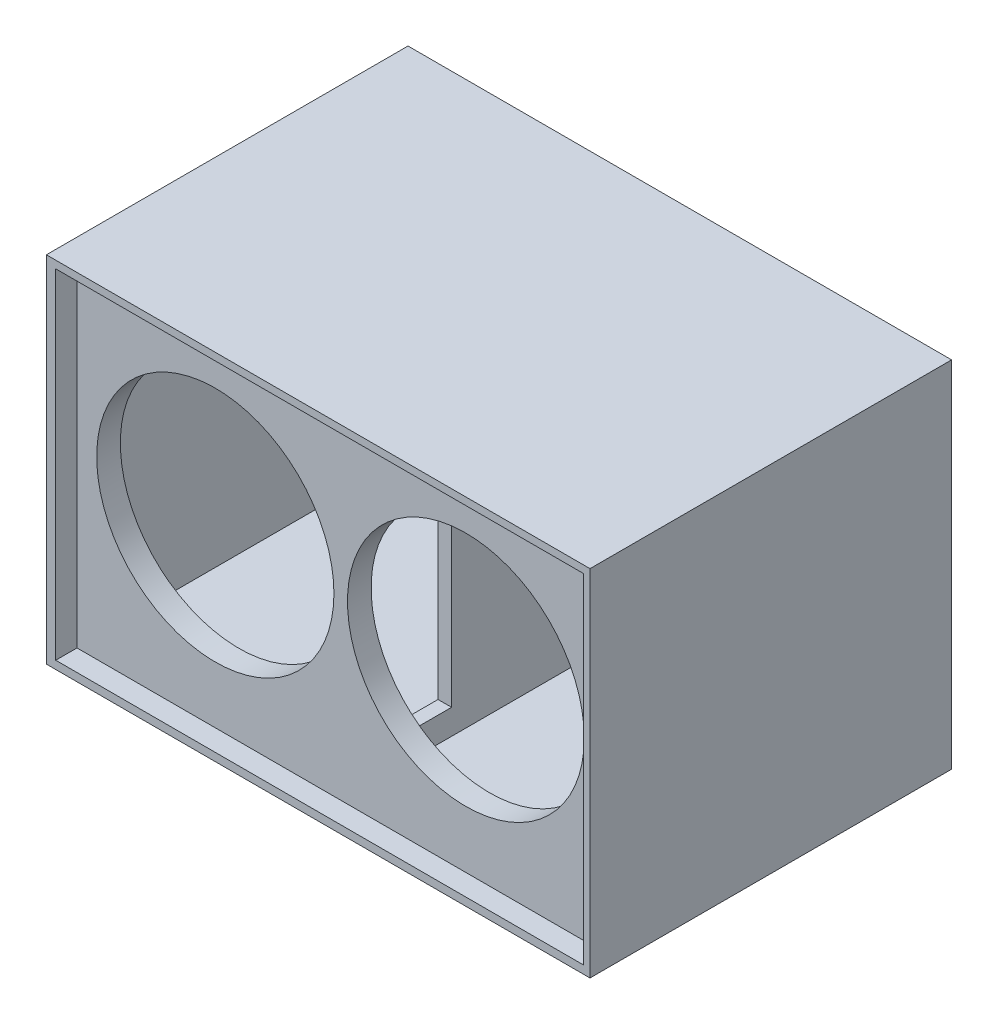
ISO-10303-21;
HEADER;
FILE_DESCRIPTION(('STEP AP214'),'2;1');
FILE_NAME('part.step','',(''),(''),'','','');
FILE_SCHEMA(('AUTOMOTIVE_DESIGN { 1 0 10303 214 1 1 1 1 }'));
ENDSEC;
DATA;
#1=APPLICATION_CONTEXT('core data for automotive mechanical design processes');
#2=APPLICATION_PROTOCOL_DEFINITION('international standard','automotive_design',2000,#1);
#3=PRODUCT_CONTEXT('',#1,'mechanical');
#4=PRODUCT('Part','Part','',(#3));
#5=PRODUCT_RELATED_PRODUCT_CATEGORY('part','',(#4));
#6=PRODUCT_DEFINITION_FORMATION('','',#4);
#7=PRODUCT_DEFINITION_CONTEXT('part definition',#1,'design');
#8=PRODUCT_DEFINITION('design','',#6,#7);
#9=PRODUCT_DEFINITION_SHAPE('','',#8);
#10=(LENGTH_UNIT() NAMED_UNIT(*) SI_UNIT(.MILLI.,.METRE.));
#11=(NAMED_UNIT(*) PLANE_ANGLE_UNIT() SI_UNIT($,.RADIAN.));
#12=(NAMED_UNIT(*) SI_UNIT($,.STERADIAN.) SOLID_ANGLE_UNIT());
#13=UNCERTAINTY_MEASURE_WITH_UNIT(LENGTH_MEASURE(1.E-05),#10,'distance_accuracy_value','');
#14=(GEOMETRIC_REPRESENTATION_CONTEXT(3) GLOBAL_UNCERTAINTY_ASSIGNED_CONTEXT((#13)) GLOBAL_UNIT_ASSIGNED_CONTEXT((#10,
#11,#12)) REPRESENTATION_CONTEXT('',''));
#15=CARTESIAN_POINT('',(0.,0.,0.));
#16=DIRECTION('',(0.,0.,1.));
#17=DIRECTION('',(1.,0.,0.));
#18=AXIS2_PLACEMENT_3D('',#15,#16,#17);
#19=CARTESIAN_POINT('',(-48.385288775752,0.,123.));
#20=DIRECTION('',(0.,0.,1.));
#21=DIRECTION('',(1.,0.,0.));
#22=AXIS2_PLACEMENT_3D('',#19,#20,#21);
#23=CYLINDRICAL_SURFACE('',#22,50.1883023827374);
#24=CARTESIAN_POINT('',(-48.385288775752,0.,134.));
#25=DIRECTION('',(0.,0.,-1.));
#26=DIRECTION('',(-1.,0.,0.));
#27=AXIS2_PLACEMENT_3D('',#24,#25,#26);
#28=CIRCLE('',#27,50.1883023827374);
#29=CARTESIAN_POINT('',(1.8030136069854,0.,134.));
#30=VERTEX_POINT('',#29);
#31=EDGE_CURVE('E335',#30,#30,#28,.F.);
#32=CARTESIAN_POINT('',(-48.385288775752,0.,144.));
#33=DIRECTION('',(0.,0.,1.));
#34=DIRECTION('',(1.,0.,0.));
#35=AXIS2_PLACEMENT_3D('',#32,#33,#34);
#36=CIRCLE('',#35,50.1883023827374);
#37=CARTESIAN_POINT('',(1.8030136069854,0.,144.));
#38=VERTEX_POINT('',#37);
#39=EDGE_CURVE('E286',#38,#38,#36,.F.);
#40=CARTESIAN_POINT('',(1.8030136069854,0.,134.));
#41=CARTESIAN_POINT('',(1.8030136069854,0.,134.104166666667));
#42=CARTESIAN_POINT('',(1.8030136069854,0.,134.208333333333));
#43=CARTESIAN_POINT('',(1.8030136069854,0.,134.416666666667));
#44=CARTESIAN_POINT('',(1.8030136069854,0.,134.520833333333));
#45=CARTESIAN_POINT('',(1.8030136069854,0.,134.729166666667));
#46=CARTESIAN_POINT('',(1.8030136069854,0.,134.833333333333));
#47=CARTESIAN_POINT('',(1.8030136069854,0.,135.041666666667));
#48=CARTESIAN_POINT('',(1.8030136069854,0.,135.145833333333));
#49=CARTESIAN_POINT('',(1.8030136069854,0.,135.354166666667));
#50=CARTESIAN_POINT('',(1.8030136069854,0.,135.458333333333));
#51=CARTESIAN_POINT('',(1.8030136069854,0.,135.666666666667));
#52=CARTESIAN_POINT('',(1.8030136069854,0.,135.770833333333));
#53=CARTESIAN_POINT('',(1.8030136069854,0.,135.979166666667));
#54=CARTESIAN_POINT('',(1.8030136069854,0.,136.083333333333));
#55=CARTESIAN_POINT('',(1.8030136069854,0.,136.291666666667));
#56=CARTESIAN_POINT('',(1.8030136069854,0.,136.395833333333));
#57=CARTESIAN_POINT('',(1.8030136069854,0.,136.604166666667));
#58=CARTESIAN_POINT('',(1.8030136069854,0.,136.708333333333));
#59=CARTESIAN_POINT('',(1.8030136069854,0.,136.916666666667));
#60=CARTESIAN_POINT('',(1.8030136069854,0.,137.020833333333));
#61=CARTESIAN_POINT('',(1.8030136069854,0.,137.229166666667));
#62=CARTESIAN_POINT('',(1.8030136069854,0.,137.333333333333));
#63=CARTESIAN_POINT('',(1.8030136069854,0.,137.541666666667));
#64=CARTESIAN_POINT('',(1.8030136069854,0.,137.645833333333));
#65=CARTESIAN_POINT('',(1.8030136069854,0.,137.854166666667));
#66=CARTESIAN_POINT('',(1.8030136069854,0.,137.958333333333));
#67=CARTESIAN_POINT('',(1.8030136069854,0.,138.166666666667));
#68=CARTESIAN_POINT('',(1.8030136069854,0.,138.270833333333));
#69=CARTESIAN_POINT('',(1.8030136069854,0.,138.479166666667));
#70=CARTESIAN_POINT('',(1.8030136069854,0.,138.583333333333));
#71=CARTESIAN_POINT('',(1.8030136069854,0.,138.791666666667));
#72=CARTESIAN_POINT('',(1.8030136069854,0.,138.895833333333));
#73=CARTESIAN_POINT('',(1.8030136069854,0.,139.104166666667));
#74=CARTESIAN_POINT('',(1.8030136069854,0.,139.208333333333));
#75=CARTESIAN_POINT('',(1.8030136069854,0.,139.416666666667));
#76=CARTESIAN_POINT('',(1.8030136069854,0.,139.520833333333));
#77=CARTESIAN_POINT('',(1.8030136069854,0.,139.729166666667));
#78=CARTESIAN_POINT('',(1.8030136069854,0.,139.833333333333));
#79=CARTESIAN_POINT('',(1.8030136069854,0.,140.041666666667));
#80=CARTESIAN_POINT('',(1.8030136069854,0.,140.145833333333));
#81=CARTESIAN_POINT('',(1.8030136069854,0.,140.354166666667));
#82=CARTESIAN_POINT('',(1.8030136069854,0.,140.458333333333));
#83=CARTESIAN_POINT('',(1.8030136069854,0.,140.666666666667));
#84=CARTESIAN_POINT('',(1.8030136069854,0.,140.770833333333));
#85=CARTESIAN_POINT('',(1.8030136069854,0.,140.979166666667));
#86=CARTESIAN_POINT('',(1.8030136069854,0.,141.083333333333));
#87=CARTESIAN_POINT('',(1.8030136069854,0.,141.291666666667));
#88=CARTESIAN_POINT('',(1.8030136069854,0.,141.395833333333));
#89=CARTESIAN_POINT('',(1.8030136069854,0.,141.604166666667));
#90=CARTESIAN_POINT('',(1.8030136069854,0.,141.708333333333));
#91=CARTESIAN_POINT('',(1.8030136069854,0.,141.916666666667));
#92=CARTESIAN_POINT('',(1.8030136069854,0.,142.020833333333));
#93=CARTESIAN_POINT('',(1.8030136069854,0.,142.229166666667));
#94=CARTESIAN_POINT('',(1.8030136069854,0.,142.333333333333));
#95=CARTESIAN_POINT('',(1.8030136069854,0.,142.541666666667));
#96=CARTESIAN_POINT('',(1.8030136069854,0.,142.645833333333));
#97=CARTESIAN_POINT('',(1.8030136069854,0.,142.854166666667));
#98=CARTESIAN_POINT('',(1.8030136069854,0.,142.958333333333));
#99=CARTESIAN_POINT('',(1.8030136069854,0.,143.166666666667));
#100=CARTESIAN_POINT('',(1.8030136069854,0.,143.270833333333));
#101=CARTESIAN_POINT('',(1.8030136069854,0.,143.479166666667));
#102=CARTESIAN_POINT('',(1.8030136069854,0.,143.583333333333));
#103=CARTESIAN_POINT('',(1.8030136069854,0.,143.791666666667));
#104=CARTESIAN_POINT('',(1.8030136069854,0.,143.895833333333));
#105=CARTESIAN_POINT('',(1.8030136069854,0.,144.));
#106=B_SPLINE_CURVE_WITH_KNOTS('',3,(#40,#41,#42,#43,#44,#45,#46,#47,#48,#49,#50,#51,#52,#53,
#54,#55,#56,#57,#58,#59,#60,#61,#62,#63,#64,#65,#66,#67,#68,#69,#70,#71,#72,#73,#74,#75,#76,#77,
#78,#79,#80,#81,#82,#83,#84,#85,#86,#87,#88,#89,#90,#91,#92,#93,#94,#95,#96,#97,#98,#99,#100,
#101,#102,#103,#104,#105),.UNSPECIFIED.,.F.,.F.,(4,2,2,2,2,2,2,2,2,2,2,2,2,2,2,2,2,2,2,2,2,2,2,
2,2,2,2,2,2,2,2,2,4),(0.,0.312500000000021,0.625000000000014,0.937500000000008,1.25,
1.56250000000002,1.87500000000002,2.18750000000001,2.5,2.81250000000002,3.12500000000002,
3.43750000000001,3.75,4.06250000000002,4.37500000000002,4.68750000000001,5.,5.31250000000003,
5.62500000000002,5.93750000000001,6.25000000000001,6.56250000000003,6.87500000000002,
7.18750000000001,7.50000000000001,7.81250000000003,8.12500000000002,8.43750000000001,
8.75000000000001,9.06250000000003,9.37500000000002,9.68750000000002,10.),.UNSPECIFIED.);
#107=EDGE_CURVE('BSEAM44',#30,#38,#106,.T.);
#108=ORIENTED_EDGE('',*,*,#31,.F.);
#109=ORIENTED_EDGE('',*,*,#39,.F.);
#110=ORIENTED_EDGE('',*,*,#107,.T.);
#111=ORIENTED_EDGE('',*,*,#107,.F.);
#112=EDGE_LOOP('',(#108,#110,#109,#111));
#113=FACE_BOUND('',#112,.T.);
#114=ADVANCED_FACE('F44',(#113),#23,.F.);
#115=CARTESIAN_POINT('',(57.6272265310004,0.,123.));
#116=DIRECTION('',(0.,0.,1.));
#117=DIRECTION('',(1.,0.,0.));
#118=AXIS2_PLACEMENT_3D('',#115,#116,#117);
#119=CYLINDRICAL_SURFACE('',#118,50.0879555620102);
#120=CARTESIAN_POINT('',(57.6272265310004,0.,134.));
#121=DIRECTION('',(0.,0.,-1.));
#122=DIRECTION('',(-1.,0.,0.));
#123=AXIS2_PLACEMENT_3D('',#120,#121,#122);
#124=CIRCLE('',#123,50.0879555620102);
#125=CARTESIAN_POINT('',(107.715182093011,0.,134.));
#126=VERTEX_POINT('',#125);
#127=EDGE_CURVE('E328',#126,#126,#124,.F.);
#128=CARTESIAN_POINT('',(57.6272265310004,0.,144.));
#129=DIRECTION('',(0.,0.,1.));
#130=DIRECTION('',(1.,0.,0.));
#131=AXIS2_PLACEMENT_3D('',#128,#129,#130);
#132=CIRCLE('',#131,50.0879555620102);
#133=CARTESIAN_POINT('',(107.715182093011,0.,144.));
#134=VERTEX_POINT('',#133);
#135=EDGE_CURVE('E48',#134,#134,#132,.F.);
#136=CARTESIAN_POINT('',(107.715182093011,0.,134.));
#137=CARTESIAN_POINT('',(107.715182093011,0.,134.104166666667));
#138=CARTESIAN_POINT('',(107.715182093011,0.,134.208333333333));
#139=CARTESIAN_POINT('',(107.715182093011,0.,134.416666666667));
#140=CARTESIAN_POINT('',(107.715182093011,0.,134.520833333333));
#141=CARTESIAN_POINT('',(107.715182093011,0.,134.729166666667));
#142=CARTESIAN_POINT('',(107.715182093011,0.,134.833333333333));
#143=CARTESIAN_POINT('',(107.715182093011,0.,135.041666666667));
#144=CARTESIAN_POINT('',(107.715182093011,0.,135.145833333333));
#145=CARTESIAN_POINT('',(107.715182093011,0.,135.354166666667));
#146=CARTESIAN_POINT('',(107.715182093011,0.,135.458333333333));
#147=CARTESIAN_POINT('',(107.715182093011,0.,135.666666666667));
#148=CARTESIAN_POINT('',(107.715182093011,0.,135.770833333333));
#149=CARTESIAN_POINT('',(107.715182093011,0.,135.979166666667));
#150=CARTESIAN_POINT('',(107.715182093011,0.,136.083333333333));
#151=CARTESIAN_POINT('',(107.715182093011,0.,136.291666666667));
#152=CARTESIAN_POINT('',(107.715182093011,0.,136.395833333333));
#153=CARTESIAN_POINT('',(107.715182093011,0.,136.604166666667));
#154=CARTESIAN_POINT('',(107.715182093011,0.,136.708333333333));
#155=CARTESIAN_POINT('',(107.715182093011,0.,136.916666666667));
#156=CARTESIAN_POINT('',(107.715182093011,0.,137.020833333333));
#157=CARTESIAN_POINT('',(107.715182093011,0.,137.229166666667));
#158=CARTESIAN_POINT('',(107.715182093011,0.,137.333333333333));
#159=CARTESIAN_POINT('',(107.715182093011,0.,137.541666666667));
#160=CARTESIAN_POINT('',(107.715182093011,0.,137.645833333333));
#161=CARTESIAN_POINT('',(107.715182093011,0.,137.854166666667));
#162=CARTESIAN_POINT('',(107.715182093011,0.,137.958333333333));
#163=CARTESIAN_POINT('',(107.715182093011,0.,138.166666666667));
#164=CARTESIAN_POINT('',(107.715182093011,0.,138.270833333333));
#165=CARTESIAN_POINT('',(107.715182093011,0.,138.479166666667));
#166=CARTESIAN_POINT('',(107.715182093011,0.,138.583333333333));
#167=CARTESIAN_POINT('',(107.715182093011,0.,138.791666666667));
#168=CARTESIAN_POINT('',(107.715182093011,0.,138.895833333333));
#169=CARTESIAN_POINT('',(107.715182093011,0.,139.104166666667));
#170=CARTESIAN_POINT('',(107.715182093011,0.,139.208333333333));
#171=CARTESIAN_POINT('',(107.715182093011,0.,139.416666666667));
#172=CARTESIAN_POINT('',(107.715182093011,0.,139.520833333333));
#173=CARTESIAN_POINT('',(107.715182093011,0.,139.729166666667));
#174=CARTESIAN_POINT('',(107.715182093011,0.,139.833333333333));
#175=CARTESIAN_POINT('',(107.715182093011,0.,140.041666666667));
#176=CARTESIAN_POINT('',(107.715182093011,0.,140.145833333333));
#177=CARTESIAN_POINT('',(107.715182093011,0.,140.354166666667));
#178=CARTESIAN_POINT('',(107.715182093011,0.,140.458333333333));
#179=CARTESIAN_POINT('',(107.715182093011,0.,140.666666666667));
#180=CARTESIAN_POINT('',(107.715182093011,0.,140.770833333333));
#181=CARTESIAN_POINT('',(107.715182093011,0.,140.979166666667));
#182=CARTESIAN_POINT('',(107.715182093011,0.,141.083333333333));
#183=CARTESIAN_POINT('',(107.715182093011,0.,141.291666666667));
#184=CARTESIAN_POINT('',(107.715182093011,0.,141.395833333333));
#185=CARTESIAN_POINT('',(107.715182093011,0.,141.604166666667));
#186=CARTESIAN_POINT('',(107.715182093011,0.,141.708333333333));
#187=CARTESIAN_POINT('',(107.715182093011,0.,141.916666666667));
#188=CARTESIAN_POINT('',(107.715182093011,0.,142.020833333333));
#189=CARTESIAN_POINT('',(107.715182093011,0.,142.229166666667));
#190=CARTESIAN_POINT('',(107.715182093011,0.,142.333333333333));
#191=CARTESIAN_POINT('',(107.715182093011,0.,142.541666666667));
#192=CARTESIAN_POINT('',(107.715182093011,0.,142.645833333333));
#193=CARTESIAN_POINT('',(107.715182093011,0.,142.854166666667));
#194=CARTESIAN_POINT('',(107.715182093011,0.,142.958333333333));
#195=CARTESIAN_POINT('',(107.715182093011,0.,143.166666666667));
#196=CARTESIAN_POINT('',(107.715182093011,0.,143.270833333333));
#197=CARTESIAN_POINT('',(107.715182093011,0.,143.479166666667));
#198=CARTESIAN_POINT('',(107.715182093011,0.,143.583333333333));
#199=CARTESIAN_POINT('',(107.715182093011,0.,143.791666666667));
#200=CARTESIAN_POINT('',(107.715182093011,0.,143.895833333333));
#201=CARTESIAN_POINT('',(107.715182093011,0.,144.));
#202=B_SPLINE_CURVE_WITH_KNOTS('',3,(#136,#137,#138,#139,#140,#141,#142,#143,#144,#145,#146,
#147,#148,#149,#150,#151,#152,#153,#154,#155,#156,#157,#158,#159,#160,#161,#162,#163,#164,#165,
#166,#167,#168,#169,#170,#171,#172,#173,#174,#175,#176,#177,#178,#179,#180,#181,#182,#183,#184,
#185,#186,#187,#188,#189,#190,#191,#192,#193,#194,#195,#196,#197,#198,#199,#200,#201),
.UNSPECIFIED.,.F.,.F.,(4,2,2,2,2,2,2,2,2,2,2,2,2,2,2,2,2,2,2,2,2,2,2,2,2,2,2,2,2,2,2,2,4),(0.,
0.312500000000021,0.625000000000014,0.937500000000008,1.25,1.56250000000002,1.87500000000002,
2.18750000000001,2.5,2.81250000000002,3.12500000000002,3.43750000000001,3.75,4.06250000000002,
4.37500000000002,4.68750000000001,5.,5.31250000000003,5.62500000000002,5.93750000000001,
6.25000000000001,6.56250000000003,6.87500000000002,7.18750000000001,7.50000000000001,
7.81250000000003,8.12500000000002,8.43750000000001,8.75000000000001,9.06250000000003,
9.37500000000002,9.68750000000002,10.),.UNSPECIFIED.);
#203=EDGE_CURVE('BSEAM359',#126,#134,#202,.T.);
#204=ORIENTED_EDGE('',*,*,#127,.F.);
#205=ORIENTED_EDGE('',*,*,#135,.F.);
#206=ORIENTED_EDGE('',*,*,#203,.T.);
#207=ORIENTED_EDGE('',*,*,#203,.F.);
#208=EDGE_LOOP('',(#204,#206,#205,#207));
#209=FACE_BOUND('',#208,.T.);
#210=ADVANCED_FACE('F359',(#209),#119,.F.);
#211=CARTESIAN_POINT('',(-110.858725761773,72.3130193905817,150.));
#212=DIRECTION('',(1.,0.,0.));
#213=DIRECTION('',(0.,1.,0.));
#214=AXIS2_PLACEMENT_3D('',#211,#212,#213);
#215=PLANE('',#214);
#216=DIRECTION('',(0.,-1.,0.));
#217=VECTOR('',#216,1.);
#218=CARTESIAN_POINT('',(-110.858725761773,72.3130193905817,0.));
#219=LINE('',#218,#217);
#220=CARTESIAN_POINT('',(-110.858725761773,72.3130193905817,0.));
#221=VERTEX_POINT('',#220);
#222=CARTESIAN_POINT('',(-110.858725761773,-77.6869806094183,0.));
#223=VERTEX_POINT('',#222);
#224=EDGE_CURVE('E338',#221,#223,#219,.T.);
#225=ORIENTED_EDGE('',*,*,#224,.T.);
#226=DIRECTION('',(0.,0.,-1.));
#227=VECTOR('',#226,1.);
#228=CARTESIAN_POINT('',(-110.858725761773,-77.6869806094183,150.));
#229=LINE('',#228,#227);
#230=CARTESIAN_POINT('',(-110.858725761773,-77.6869806094183,153.));
#231=VERTEX_POINT('',#230);
#232=EDGE_CURVE('E13',#231,#223,#229,.T.);
#233=ORIENTED_EDGE('',*,*,#232,.F.);
#234=DIRECTION('',(0.,-1.,0.));
#235=VECTOR('',#234,1.);
#236=CARTESIAN_POINT('',(-110.858725761773,72.3130193905817,153.));
#237=LINE('',#236,#235);
#238=CARTESIAN_POINT('',(-110.858725761773,72.3130193905817,153.));
#239=VERTEX_POINT('',#238);
#240=EDGE_CURVE('E289',#239,#231,#237,.T.);
#241=ORIENTED_EDGE('',*,*,#240,.F.);
#242=DIRECTION('',(0.,0.,-1.));
#243=VECTOR('',#242,1.);
#244=CARTESIAN_POINT('',(-110.858725761773,72.3130193905817,150.));
#245=LINE('',#244,#243);
#246=EDGE_CURVE('E347',#239,#221,#245,.T.);
#247=ORIENTED_EDGE('',*,*,#246,.T.);
#248=EDGE_LOOP('',(#225,#233,#241,#247));
#249=FACE_BOUND('',#248,.T.);
#250=ADVANCED_FACE('F46',(#249),#215,.F.);
#251=CARTESIAN_POINT('',(-110.858725761773,-77.6869806094183,150.));
#252=DIRECTION('',(0.,1.,0.));
#253=DIRECTION('',(0.,0.,1.));
#254=AXIS2_PLACEMENT_3D('',#251,#252,#253);
#255=PLANE('',#254);
#256=DIRECTION('',(1.,0.,0.));
#257=VECTOR('',#256,1.);
#258=CARTESIAN_POINT('',(-110.858725761773,-77.6869806094183,0.));
#259=LINE('',#258,#257);
#260=CARTESIAN_POINT('',(119.141274238227,-77.6869806094183,0.));
#261=VERTEX_POINT('',#260);
#262=EDGE_CURVE('E341',#223,#261,#259,.T.);
#263=ORIENTED_EDGE('',*,*,#262,.T.);
#264=DIRECTION('',(0.,0.,-1.));
#265=VECTOR('',#264,1.);
#266=CARTESIAN_POINT('',(119.141274238227,-77.6869806094183,150.));
#267=LINE('',#266,#265);
#268=CARTESIAN_POINT('',(119.141274238227,-77.6869806094183,153.));
#269=VERTEX_POINT('',#268);
#270=EDGE_CURVE('E53',#269,#261,#267,.T.);
#271=ORIENTED_EDGE('',*,*,#270,.F.);
#272=DIRECTION('',(1.,0.,0.));
#273=VECTOR('',#272,1.);
#274=CARTESIAN_POINT('',(-110.858725761773,-77.6869806094183,153.));
#275=LINE('',#274,#273);
#276=EDGE_CURVE('E292',#231,#269,#275,.T.);
#277=ORIENTED_EDGE('',*,*,#276,.F.);
#278=ORIENTED_EDGE('',*,*,#232,.T.);
#279=EDGE_LOOP('',(#263,#271,#277,#278));
#280=FACE_BOUND('',#279,.T.);
#281=ADVANCED_FACE('F394',(#280),#255,.F.);
#282=CARTESIAN_POINT('',(119.141274238227,72.3130193905817,150.));
#283=DIRECTION('',(-1.,0.,0.));
#284=DIRECTION('',(0.,-1.,0.));
#285=AXIS2_PLACEMENT_3D('',#282,#283,#284);
#286=PLANE('',#285);
#287=DIRECTION('',(0.,1.,0.));
#288=VECTOR('',#287,1.);
#289=CARTESIAN_POINT('',(119.141274238227,72.3130193905817,0.));
#290=LINE('',#289,#288);
#291=CARTESIAN_POINT('',(119.141274238227,72.3130193905817,0.));
#292=VERTEX_POINT('',#291);
#293=EDGE_CURVE('E343',#261,#292,#290,.T.);
#294=ORIENTED_EDGE('',*,*,#293,.T.);
#295=DIRECTION('',(0.,0.,-1.));
#296=VECTOR('',#295,1.);
#297=CARTESIAN_POINT('',(119.141274238227,72.3130193905817,150.));
#298=LINE('',#297,#296);
#299=CARTESIAN_POINT('',(119.141274238227,72.3130193905817,153.));
#300=VERTEX_POINT('',#299);
#301=EDGE_CURVE('E350',#300,#292,#298,.T.);
#302=ORIENTED_EDGE('',*,*,#301,.F.);
#303=DIRECTION('',(0.,1.,0.));
#304=VECTOR('',#303,1.);
#305=CARTESIAN_POINT('',(119.141274238227,72.3130193905817,153.));
#306=LINE('',#305,#304);
#307=EDGE_CURVE('E295',#269,#300,#306,.T.);
#308=ORIENTED_EDGE('',*,*,#307,.F.);
#309=ORIENTED_EDGE('',*,*,#270,.T.);
#310=EDGE_LOOP('',(#294,#302,#308,#309));
#311=FACE_BOUND('',#310,.T.);
#312=ADVANCED_FACE('F391',(#311),#286,.F.);
#313=CARTESIAN_POINT('',(-110.858725761773,72.3130193905817,150.));
#314=DIRECTION('',(0.,-1.,0.));
#315=DIRECTION('',(0.,0.,-1.));
#316=AXIS2_PLACEMENT_3D('',#313,#314,#315);
#317=PLANE('',#316);
#318=DIRECTION('',(-1.,0.,0.));
#319=VECTOR('',#318,1.);
#320=CARTESIAN_POINT('',(-110.858725761773,72.3130193905817,0.));
#321=LINE('',#320,#319);
#322=EDGE_CURVE('E345',#292,#221,#321,.T.);
#323=ORIENTED_EDGE('',*,*,#322,.T.);
#324=ORIENTED_EDGE('',*,*,#246,.F.);
#325=DIRECTION('',(-1.,0.,0.));
#326=VECTOR('',#325,1.);
#327=CARTESIAN_POINT('',(-110.858725761773,72.3130193905817,153.));
#328=LINE('',#327,#326);
#329=EDGE_CURVE('E298',#300,#239,#328,.T.);
#330=ORIENTED_EDGE('',*,*,#329,.F.);
#331=ORIENTED_EDGE('',*,*,#301,.T.);
#332=EDGE_LOOP('',(#323,#324,#330,#331));
#333=FACE_BOUND('',#332,.T.);
#334=ADVANCED_FACE('F387',(#333),#317,.F.);
#335=CARTESIAN_POINT('',(0.,0.,0.));
#336=DIRECTION('',(0.,0.,1.));
#337=DIRECTION('',(1.,0.,0.));
#338=AXIS2_PLACEMENT_3D('',#335,#336,#337);
#339=PLANE('',#338);
#340=CARTESIAN_POINT('',(-108.173667938772,-74.4771524291912,0.));
#341=DIRECTION('',(0.,0.,-1.));
#342=DIRECTION('',(-1.,0.,0.));
#343=AXIS2_PLACEMENT_3D('',#340,#341,#342);
#344=CIRCLE('',#343,1.5);
#345=CARTESIAN_POINT('',(-109.673667938772,-74.4771524291912,0.));
#346=VERTEX_POINT('',#345);
#347=EDGE_CURVE('E212',#346,#346,#344,.T.);
#348=ORIENTED_EDGE('',*,*,#347,.F.);
#349=EDGE_LOOP('',(#348));
#350=FACE_BOUND('',#349,.T.);
#351=CARTESIAN_POINT('',(116.215713327053,69.3436942985291,0.));
#352=DIRECTION('',(0.,0.,-1.));
#353=DIRECTION('',(-1.,0.,0.));
#354=AXIS2_PLACEMENT_3D('',#351,#352,#353);
#355=CIRCLE('',#354,1.5);
#356=CARTESIAN_POINT('',(114.715713327053,69.3436942985291,0.));
#357=VERTEX_POINT('',#356);
#358=EDGE_CURVE('E216',#357,#357,#355,.T.);
#359=ORIENTED_EDGE('',*,*,#358,.F.);
#360=EDGE_LOOP('',(#359));
#361=FACE_BOUND('',#360,.T.);
#362=DIRECTION('',(-1.,0.,0.));
#363=VECTOR('',#362,1.);
#364=CARTESIAN_POINT('',(113.751499340457,-72.6024743015406,0.));
#365=LINE('',#364,#363);
#366=CARTESIAN_POINT('',(113.751499340457,-72.6024743015406,0.));
#367=VERTEX_POINT('',#366);
#368=CARTESIAN_POINT('',(-105.468950864003,-72.6024743015406,0.));
#369=VERTEX_POINT('',#368);
#370=EDGE_CURVE('E318',#367,#369,#365,.T.);
#371=ORIENTED_EDGE('',*,*,#370,.F.);
#372=DIRECTION('',(0.,-1.,0.));
#373=VECTOR('',#372,1.);
#374=CARTESIAN_POINT('',(113.751499340457,66.269123803911,0.));
#375=LINE('',#374,#373);
#376=CARTESIAN_POINT('',(113.751499340457,66.269123803911,0.));
#377=VERTEX_POINT('',#376);
#378=EDGE_CURVE('E301',#377,#367,#375,.T.);
#379=ORIENTED_EDGE('',*,*,#378,.F.);
#380=DIRECTION('',(1.,0.,0.));
#381=VECTOR('',#380,1.);
#382=CARTESIAN_POINT('',(113.751499340457,66.269123803911,0.));
#383=LINE('',#382,#381);
#384=CARTESIAN_POINT('',(-105.468950864003,66.269123803911,0.));
#385=VERTEX_POINT('',#384);
#386=EDGE_CURVE('E306',#385,#377,#383,.T.);
#387=ORIENTED_EDGE('',*,*,#386,.F.);
#388=DIRECTION('',(0.,1.,0.));
#389=VECTOR('',#388,1.);
#390=CARTESIAN_POINT('',(-105.468950864003,66.269123803911,0.));
#391=LINE('',#390,#389);
#392=EDGE_CURVE('E321',#369,#385,#391,.T.);
#393=ORIENTED_EDGE('',*,*,#392,.F.);
#394=EDGE_LOOP('',(#371,#379,#387,#393));
#395=FACE_BOUND('',#394,.T.);
#396=ORIENTED_EDGE('',*,*,#224,.F.);
#397=ORIENTED_EDGE('',*,*,#322,.F.);
#398=ORIENTED_EDGE('',*,*,#293,.F.);
#399=ORIENTED_EDGE('',*,*,#262,.F.);
#400=EDGE_LOOP('',(#396,#397,#398,#399));
#401=FACE_BOUND('',#400,.T.);
#402=ADVANCED_FACE('F384',(#350,#361,#395,#401),#339,.F.);
#403=CARTESIAN_POINT('',(0.,0.,134.));
#404=DIRECTION('',(0.,0.,-1.));
#405=DIRECTION('',(-1.,0.,0.));
#406=AXIS2_PLACEMENT_3D('',#403,#404,#405);
#407=PLANE('',#406);
#408=DIRECTION('',(0.,-1.,0.));
#409=VECTOR('',#408,1.);
#410=CARTESIAN_POINT('',(1.8030136069854,0.,134.));
#411=LINE('',#410,#409);
#412=CARTESIAN_POINT('',(1.8030136069854,66.269123803911,134.));
#413=VERTEX_POINT('',#412);
#414=CARTESIAN_POINT('',(1.8030136069854,55.057934708681,134.));
#415=VERTEX_POINT('',#414);
#416=EDGE_CURVE('E236',#413,#415,#411,.T.);
#417=ORIENTED_EDGE('',*,*,#416,.T.);
#418=DIRECTION('',(1.,0.,0.));
#419=VECTOR('',#418,1.);
#420=CARTESIAN_POINT('',(-2.46072903100986,55.057934708681,134.));
#421=LINE('',#420,#419);
#422=CARTESIAN_POINT('',(7.53927096899013,55.057934708681,134.));
#423=VERTEX_POINT('',#422);
#424=EDGE_CURVE('E203',#415,#423,#421,.T.);
#425=ORIENTED_EDGE('',*,*,#424,.T.);
#426=DIRECTION('',(0.,-1.,0.));
#427=VECTOR('',#426,1.);
#428=CARTESIAN_POINT('',(7.53927096899013,0.,134.));
#429=LINE('',#428,#427);
#430=CARTESIAN_POINT('',(7.53927096899013,66.269123803911,134.));
#431=VERTEX_POINT('',#430);
#432=EDGE_CURVE('E240',#431,#423,#429,.T.);
#433=ORIENTED_EDGE('',*,*,#432,.F.);
#434=DIRECTION('',(1.,0.,0.));
#435=VECTOR('',#434,1.);
#436=CARTESIAN_POINT('',(113.751499340457,66.269123803911,134.));
#437=LINE('',#436,#435);
#438=CARTESIAN_POINT('',(113.751499340457,66.269123803911,134.));
#439=VERTEX_POINT('',#438);
#440=EDGE_CURVE('E312',#431,#439,#437,.T.);
#441=ORIENTED_EDGE('',*,*,#440,.T.);
#442=DIRECTION('',(0.,-1.,0.));
#443=VECTOR('',#442,1.);
#444=CARTESIAN_POINT('',(113.751499340457,66.269123803911,134.));
#445=LINE('',#444,#443);
#446=CARTESIAN_POINT('',(113.751499340457,-72.6024743015406,134.));
#447=VERTEX_POINT('',#446);
#448=EDGE_CURVE('E302',#439,#447,#445,.T.);
#449=ORIENTED_EDGE('',*,*,#448,.T.);
#450=DIRECTION('',(-1.,0.,0.));
#451=VECTOR('',#450,1.);
#452=CARTESIAN_POINT('',(113.751499340457,-72.6024743015406,134.));
#453=LINE('',#452,#451);
#454=CARTESIAN_POINT('',(-105.468950864003,-72.6024743015406,134.));
#455=VERTEX_POINT('',#454);
#456=EDGE_CURVE('E305',#447,#455,#453,.T.);
#457=ORIENTED_EDGE('',*,*,#456,.T.);
#458=DIRECTION('',(0.,1.,0.));
#459=VECTOR('',#458,1.);
#460=CARTESIAN_POINT('',(-105.468950864003,66.269123803911,134.));
#461=LINE('',#460,#459);
#462=CARTESIAN_POINT('',(-105.468950864003,66.269123803911,134.));
#463=VERTEX_POINT('',#462);
#464=EDGE_CURVE('E309',#455,#463,#461,.T.);
#465=ORIENTED_EDGE('',*,*,#464,.T.);
#466=EDGE_CURVE('E313',#463,#413,#437,.T.);
#467=ORIENTED_EDGE('',*,*,#466,.T.);
#468=EDGE_LOOP('',(#417,#425,#433,#441,#449,#457,#465,#467));
#469=FACE_BOUND('',#468,.T.);
#470=ORIENTED_EDGE('',*,*,#31,.T.);
#471=EDGE_LOOP('',(#470));
#472=FACE_BOUND('',#471,.T.);
#473=DIRECTION('',(1.,0.,0.));
#474=VECTOR('',#473,1.);
#475=CARTESIAN_POINT('',(-2.46072903100986,-60.8218011135713,134.));
#476=LINE('',#475,#474);
#477=CARTESIAN_POINT('',(1.8030136069854,-60.8218011135713,134.));
#478=VERTEX_POINT('',#477);
#479=CARTESIAN_POINT('',(7.53927096899013,-60.8218011135713,134.));
#480=VERTEX_POINT('',#479);
#481=EDGE_CURVE('E66',#478,#480,#476,.T.);
#482=ORIENTED_EDGE('',*,*,#481,.F.);
#483=CARTESIAN_POINT('',(1.8030136069854,-71.4592710423565,134.));
#484=VERTEX_POINT('',#483);
#485=EDGE_CURVE('E222',#478,#484,#411,.T.);
#486=ORIENTED_EDGE('',*,*,#485,.T.);
#487=DIRECTION('',(-1.,0.,0.));
#488=VECTOR('',#487,1.);
#489=CARTESIAN_POINT('',(0.,-71.4592710423565,134.));
#490=LINE('',#489,#488);
#491=CARTESIAN_POINT('',(7.53927096899013,-71.4592710423565,134.));
#492=VERTEX_POINT('',#491);
#493=EDGE_CURVE('E229',#492,#484,#490,.T.);
#494=ORIENTED_EDGE('',*,*,#493,.F.);
#495=EDGE_CURVE('E239',#480,#492,#429,.T.);
#496=ORIENTED_EDGE('',*,*,#495,.F.);
#497=EDGE_LOOP('',(#482,#486,#494,#496));
#498=FACE_BOUND('',#497,.T.);
#499=ORIENTED_EDGE('',*,*,#127,.T.);
#500=EDGE_LOOP('',(#499));
#501=FACE_BOUND('',#500,.T.);
#502=ADVANCED_FACE('F357',(#469,#472,#498,#501),#407,.T.);
#503=CARTESIAN_POINT('',(113.751499340457,66.269123803911,134.));
#504=DIRECTION('',(1.,0.,0.));
#505=DIRECTION('',(0.,0.,-1.));
#506=AXIS2_PLACEMENT_3D('',#503,#504,#505);
#507=PLANE('',#506);
#508=ORIENTED_EDGE('',*,*,#378,.T.);
#509=DIRECTION('',(0.,0.,-1.));
#510=VECTOR('',#509,1.);
#511=CARTESIAN_POINT('',(113.751499340457,-72.6024743015406,134.));
#512=LINE('',#511,#510);
#513=EDGE_CURVE('E316',#447,#367,#512,.T.);
#514=ORIENTED_EDGE('',*,*,#513,.F.);
#515=ORIENTED_EDGE('',*,*,#448,.F.);
#516=DIRECTION('',(0.,0.,-1.));
#517=VECTOR('',#516,1.);
#518=CARTESIAN_POINT('',(113.751499340457,66.269123803911,134.));
#519=LINE('',#518,#517);
#520=EDGE_CURVE('E326',#439,#377,#519,.T.);
#521=ORIENTED_EDGE('',*,*,#520,.T.);
#522=EDGE_LOOP('',(#508,#514,#515,#521));
#523=FACE_BOUND('',#522,.T.);
#524=ADVANCED_FACE('F427',(#523),#507,.F.);
#525=CARTESIAN_POINT('',(113.751499340457,66.269123803911,134.));
#526=DIRECTION('',(0.,1.,0.));
#527=DIRECTION('',(0.,0.,1.));
#528=AXIS2_PLACEMENT_3D('',#525,#526,#527);
#529=PLANE('',#528);
#530=DIRECTION('',(1.,0.,0.));
#531=VECTOR('',#530,1.);
#532=CARTESIAN_POINT('',(0.,66.269123803911,23.9999999999999));
#533=LINE('',#532,#531);
#534=CARTESIAN_POINT('',(1.8030136069854,66.269123803911,23.9999999999999));
#535=VERTEX_POINT('',#534);
#536=CARTESIAN_POINT('',(7.53927096899013,66.269123803911,23.9999999999999));
#537=VERTEX_POINT('',#536);
#538=EDGE_CURVE('E228',#535,#537,#533,.T.);
#539=ORIENTED_EDGE('',*,*,#538,.F.);
#540=DIRECTION('',(0.,0.,1.));
#541=VECTOR('',#540,1.);
#542=CARTESIAN_POINT('',(1.8030136069854,66.269123803911,23.9999999999999));
#543=LINE('',#542,#541);
#544=EDGE_CURVE('E251',#535,#413,#543,.T.);
#545=ORIENTED_EDGE('',*,*,#544,.T.);
#546=ORIENTED_EDGE('',*,*,#466,.F.);
#547=DIRECTION('',(0.,0.,-1.));
#548=VECTOR('',#547,1.);
#549=CARTESIAN_POINT('',(-105.468950864003,66.269123803911,134.));
#550=LINE('',#549,#548);
#551=EDGE_CURVE('E329',#463,#385,#550,.T.);
#552=ORIENTED_EDGE('',*,*,#551,.T.);
#553=ORIENTED_EDGE('',*,*,#386,.T.);
#554=ORIENTED_EDGE('',*,*,#520,.F.);
#555=ORIENTED_EDGE('',*,*,#440,.F.);
#556=DIRECTION('',(0.,0.,1.));
#557=VECTOR('',#556,1.);
#558=CARTESIAN_POINT('',(7.53927096899013,66.269123803911,23.9999999999999));
#559=LINE('',#558,#557);
#560=EDGE_CURVE('E249',#537,#431,#559,.T.);
#561=ORIENTED_EDGE('',*,*,#560,.F.);
#562=EDGE_LOOP('',(#539,#545,#546,#552,#553,#554,#555,#561));
#563=FACE_BOUND('',#562,.T.);
#564=ADVANCED_FACE('F429',(#563),#529,.F.);
#565=CARTESIAN_POINT('',(-105.468950864003,66.269123803911,134.));
#566=DIRECTION('',(-1.,0.,0.));
#567=DIRECTION('',(0.,0.,1.));
#568=AXIS2_PLACEMENT_3D('',#565,#566,#567);
#569=PLANE('',#568);
#570=ORIENTED_EDGE('',*,*,#392,.T.);
#571=ORIENTED_EDGE('',*,*,#551,.F.);
#572=ORIENTED_EDGE('',*,*,#464,.F.);
#573=DIRECTION('',(0.,0.,-1.));
#574=VECTOR('',#573,1.);
#575=CARTESIAN_POINT('',(-105.468950864003,-72.6024743015406,134.));
#576=LINE('',#575,#574);
#577=EDGE_CURVE('E331',#455,#369,#576,.T.);
#578=ORIENTED_EDGE('',*,*,#577,.T.);
#579=EDGE_LOOP('',(#570,#571,#572,#578));
#580=FACE_BOUND('',#579,.T.);
#581=ADVANCED_FACE('F418',(#580),#569,.F.);
#582=CARTESIAN_POINT('',(113.751499340457,-72.6024743015406,134.));
#583=DIRECTION('',(0.,-1.,0.));
#584=DIRECTION('',(0.,0.,-1.));
#585=AXIS2_PLACEMENT_3D('',#582,#583,#584);
#586=PLANE('',#585);
#587=ORIENTED_EDGE('',*,*,#370,.T.);
#588=ORIENTED_EDGE('',*,*,#577,.F.);
#589=ORIENTED_EDGE('',*,*,#456,.F.);
#590=ORIENTED_EDGE('',*,*,#513,.T.);
#591=EDGE_LOOP('',(#587,#588,#589,#590));
#592=FACE_BOUND('',#591,.T.);
#593=ADVANCED_FACE('F412',(#592),#586,.F.);
#594=CARTESIAN_POINT('',(0.,0.,153.));
#595=DIRECTION('',(0.,0.,1.));
#596=DIRECTION('',(1.,0.,0.));
#597=AXIS2_PLACEMENT_3D('',#594,#595,#596);
#598=PLANE('',#597);
#599=DIRECTION('',(0.,-1.,0.));
#600=VECTOR('',#599,1.);
#601=CARTESIAN_POINT('',(-106.908034782194,69.1472916402934,153.));
#602=LINE('',#601,#600);
#603=CARTESIAN_POINT('',(-106.908034782194,69.1472916402934,153.));
#604=VERTEX_POINT('',#603);
#605=CARTESIAN_POINT('',(-106.908034782194,-74.2814055394304,153.));
#606=VERTEX_POINT('',#605);
#607=EDGE_CURVE('E254',#604,#606,#602,.T.);
#608=ORIENTED_EDGE('',*,*,#607,.F.);
#609=DIRECTION('',(-1.,0.,0.));
#610=VECTOR('',#609,1.);
#611=CARTESIAN_POINT('',(-106.908034782194,69.1472916402934,153.));
#612=LINE('',#611,#610);
#613=CARTESIAN_POINT('',(116.389819857141,69.1472916402934,153.));
#614=VERTEX_POINT('',#613);
#615=EDGE_CURVE('E259',#614,#604,#612,.T.);
#616=ORIENTED_EDGE('',*,*,#615,.F.);
#617=DIRECTION('',(0.,1.,0.));
#618=VECTOR('',#617,1.);
#619=CARTESIAN_POINT('',(116.389819857141,69.1472916402934,153.));
#620=LINE('',#619,#618);
#621=CARTESIAN_POINT('',(116.389819857141,-74.2814055394304,153.));
#622=VERTEX_POINT('',#621);
#623=EDGE_CURVE('E273',#622,#614,#620,.T.);
#624=ORIENTED_EDGE('',*,*,#623,.F.);
#625=DIRECTION('',(1.,0.,0.));
#626=VECTOR('',#625,1.);
#627=CARTESIAN_POINT('',(-106.908034782194,-74.2814055394304,153.));
#628=LINE('',#627,#626);
#629=EDGE_CURVE('E270',#606,#622,#628,.T.);
#630=ORIENTED_EDGE('',*,*,#629,.F.);
#631=EDGE_LOOP('',(#608,#616,#624,#630));
#632=FACE_BOUND('',#631,.T.);
#633=ORIENTED_EDGE('',*,*,#240,.T.);
#634=ORIENTED_EDGE('',*,*,#276,.T.);
#635=ORIENTED_EDGE('',*,*,#307,.T.);
#636=ORIENTED_EDGE('',*,*,#329,.T.);
#637=EDGE_LOOP('',(#633,#634,#635,#636));
#638=FACE_BOUND('',#637,.T.);
#639=ADVANCED_FACE('F370',(#632,#638),#598,.T.);
#640=CARTESIAN_POINT('',(0.,0.,144.));
#641=DIRECTION('',(0.,0.,1.));
#642=DIRECTION('',(1.,0.,0.));
#643=AXIS2_PLACEMENT_3D('',#640,#641,#642);
#644=PLANE('',#643);
#645=DIRECTION('',(0.,-1.,0.));
#646=VECTOR('',#645,1.);
#647=CARTESIAN_POINT('',(-106.908034782194,69.1472916402934,144.));
#648=LINE('',#647,#646);
#649=CARTESIAN_POINT('',(-106.908034782194,69.1472916402934,144.));
#650=VERTEX_POINT('',#649);
#651=CARTESIAN_POINT('',(-106.908034782194,-74.2814055394304,144.));
#652=VERTEX_POINT('',#651);
#653=EDGE_CURVE('E255',#650,#652,#648,.T.);
#654=ORIENTED_EDGE('',*,*,#653,.T.);
#655=DIRECTION('',(1.,0.,0.));
#656=VECTOR('',#655,1.);
#657=CARTESIAN_POINT('',(-106.908034782194,-74.2814055394304,144.));
#658=LINE('',#657,#656);
#659=CARTESIAN_POINT('',(116.389819857141,-74.2814055394304,144.));
#660=VERTEX_POINT('',#659);
#661=EDGE_CURVE('E258',#652,#660,#658,.T.);
#662=ORIENTED_EDGE('',*,*,#661,.T.);
#663=DIRECTION('',(0.,1.,0.));
#664=VECTOR('',#663,1.);
#665=CARTESIAN_POINT('',(116.389819857141,69.1472916402934,144.));
#666=LINE('',#665,#664);
#667=CARTESIAN_POINT('',(116.389819857141,69.1472916402934,144.));
#668=VERTEX_POINT('',#667);
#669=EDGE_CURVE('E262',#660,#668,#666,.T.);
#670=ORIENTED_EDGE('',*,*,#669,.T.);
#671=DIRECTION('',(-1.,0.,0.));
#672=VECTOR('',#671,1.);
#673=CARTESIAN_POINT('',(-106.908034782194,69.1472916402934,144.));
#674=LINE('',#673,#672);
#675=EDGE_CURVE('E265',#668,#650,#674,.T.);
#676=ORIENTED_EDGE('',*,*,#675,.T.);
#677=EDGE_LOOP('',(#654,#662,#670,#676));
#678=FACE_BOUND('',#677,.T.);
#679=ORIENTED_EDGE('',*,*,#135,.T.);
#680=EDGE_LOOP('',(#679));
#681=FACE_BOUND('',#680,.T.);
#682=ORIENTED_EDGE('',*,*,#39,.T.);
#683=EDGE_LOOP('',(#682));
#684=FACE_BOUND('',#683,.T.);
#685=ADVANCED_FACE('F366',(#678,#681,#684),#644,.T.);
#686=CARTESIAN_POINT('',(-106.908034782194,69.1472916402934,144.));
#687=DIRECTION('',(-1.,0.,0.));
#688=DIRECTION('',(0.,0.,1.));
#689=AXIS2_PLACEMENT_3D('',#686,#687,#688);
#690=PLANE('',#689);
#691=ORIENTED_EDGE('',*,*,#607,.T.);
#692=DIRECTION('',(0.,0.,1.));
#693=VECTOR('',#692,1.);
#694=CARTESIAN_POINT('',(-106.908034782194,-74.2814055394304,144.));
#695=LINE('',#694,#693);
#696=EDGE_CURVE('E268',#652,#606,#695,.T.);
#697=ORIENTED_EDGE('',*,*,#696,.F.);
#698=ORIENTED_EDGE('',*,*,#653,.F.);
#699=DIRECTION('',(0.,0.,1.));
#700=VECTOR('',#699,1.);
#701=CARTESIAN_POINT('',(-106.908034782194,69.1472916402934,144.));
#702=LINE('',#701,#700);
#703=EDGE_CURVE('E278',#650,#604,#702,.T.);
#704=ORIENTED_EDGE('',*,*,#703,.T.);
#705=EDGE_LOOP('',(#691,#697,#698,#704));
#706=FACE_BOUND('',#705,.T.);
#707=ADVANCED_FACE('F369',(#706),#690,.F.);
#708=CARTESIAN_POINT('',(-106.908034782194,69.1472916402934,144.));
#709=DIRECTION('',(0.,1.,0.));
#710=DIRECTION('',(0.,0.,1.));
#711=AXIS2_PLACEMENT_3D('',#708,#709,#710);
#712=PLANE('',#711);
#713=ORIENTED_EDGE('',*,*,#615,.T.);
#714=ORIENTED_EDGE('',*,*,#703,.F.);
#715=ORIENTED_EDGE('',*,*,#675,.F.);
#716=DIRECTION('',(0.,0.,1.));
#717=VECTOR('',#716,1.);
#718=CARTESIAN_POINT('',(116.389819857141,69.1472916402934,144.));
#719=LINE('',#718,#717);
#720=EDGE_CURVE('E280',#668,#614,#719,.T.);
#721=ORIENTED_EDGE('',*,*,#720,.T.);
#722=EDGE_LOOP('',(#713,#714,#715,#721));
#723=FACE_BOUND('',#722,.T.);
#724=ADVANCED_FACE('F487',(#723),#712,.F.);
#725=CARTESIAN_POINT('',(116.389819857141,69.1472916402934,144.));
#726=DIRECTION('',(1.,0.,0.));
#727=DIRECTION('',(0.,0.,-1.));
#728=AXIS2_PLACEMENT_3D('',#725,#726,#727);
#729=PLANE('',#728);
#730=ORIENTED_EDGE('',*,*,#623,.T.);
#731=ORIENTED_EDGE('',*,*,#720,.F.);
#732=ORIENTED_EDGE('',*,*,#669,.F.);
#733=DIRECTION('',(0.,0.,1.));
#734=VECTOR('',#733,1.);
#735=CARTESIAN_POINT('',(116.389819857141,-74.2814055394304,144.));
#736=LINE('',#735,#734);
#737=EDGE_CURVE('E282',#660,#622,#736,.T.);
#738=ORIENTED_EDGE('',*,*,#737,.T.);
#739=EDGE_LOOP('',(#730,#731,#732,#738));
#740=FACE_BOUND('',#739,.T.);
#741=ADVANCED_FACE('F490',(#740),#729,.F.);
#742=CARTESIAN_POINT('',(-106.908034782194,-74.2814055394304,144.));
#743=DIRECTION('',(0.,-1.,0.));
#744=DIRECTION('',(0.,0.,-1.));
#745=AXIS2_PLACEMENT_3D('',#742,#743,#744);
#746=PLANE('',#745);
#747=ORIENTED_EDGE('',*,*,#629,.T.);
#748=ORIENTED_EDGE('',*,*,#737,.F.);
#749=ORIENTED_EDGE('',*,*,#661,.F.);
#750=ORIENTED_EDGE('',*,*,#696,.T.);
#751=EDGE_LOOP('',(#747,#748,#749,#750));
#752=FACE_BOUND('',#751,.T.);
#753=ADVANCED_FACE('F485',(#752),#746,.F.);
#754=CARTESIAN_POINT('',(1.8030136069854,0.,23.9999999999999));
#755=DIRECTION('',(-1.,0.,0.));
#756=DIRECTION('',(0.,0.,1.));
#757=AXIS2_PLACEMENT_3D('',#754,#755,#756);
#758=PLANE('',#757);
#759=DIRECTION('',(0.,0.,-1.));
#760=VECTOR('',#759,1.);
#761=CARTESIAN_POINT('',(1.8030136069854,55.057934708681,23.9999999999999));
#762=LINE('',#761,#760);
#763=CARTESIAN_POINT('',(1.8030136069854,55.057934708681,99.9549854790303));
#764=VERTEX_POINT('',#763);
#765=EDGE_CURVE('E210',#415,#764,#762,.T.);
#766=ORIENTED_EDGE('',*,*,#765,.F.);
#767=ORIENTED_EDGE('',*,*,#416,.F.);
#768=ORIENTED_EDGE('',*,*,#544,.F.);
#769=DIRECTION('',(0.,-1.,0.));
#770=VECTOR('',#769,1.);
#771=CARTESIAN_POINT('',(1.8030136069854,0.,23.9999999999999));
#772=LINE('',#771,#770);
#773=CARTESIAN_POINT('',(1.8030136069854,-71.4592710423565,23.9999999999999));
#774=VERTEX_POINT('',#773);
#775=EDGE_CURVE('E225',#535,#774,#772,.T.);
#776=ORIENTED_EDGE('',*,*,#775,.T.);
#777=DIRECTION('',(0.,0.,1.));
#778=VECTOR('',#777,1.);
#779=CARTESIAN_POINT('',(1.8030136069854,-71.4592710423565,23.9999999999999));
#780=LINE('',#779,#778);
#781=EDGE_CURVE('E235',#774,#484,#780,.T.);
#782=ORIENTED_EDGE('',*,*,#781,.T.);
#783=ORIENTED_EDGE('',*,*,#485,.F.);
#784=DIRECTION('',(0.,0.,1.));
#785=VECTOR('',#784,1.);
#786=CARTESIAN_POINT('',(1.8030136069854,-60.8218011135713,23.9999999999999));
#787=LINE('',#786,#785);
#788=CARTESIAN_POINT('',(1.8030136069854,-60.8218011135713,99.9549854790303));
#789=VERTEX_POINT('',#788);
#790=EDGE_CURVE('E205',#789,#478,#787,.T.);
#791=ORIENTED_EDGE('',*,*,#790,.F.);
#792=DIRECTION('',(0.,-1.,0.));
#793=VECTOR('',#792,1.);
#794=CARTESIAN_POINT('',(1.8030136069854,0.,99.9549854790303));
#795=LINE('',#794,#793);
#796=EDGE_CURVE('E187',#764,#789,#795,.T.);
#797=ORIENTED_EDGE('',*,*,#796,.F.);
#798=EDGE_LOOP('',(#766,#767,#768,#776,#782,#783,#791,#797));
#799=FACE_BOUND('',#798,.T.);
#800=ADVANCED_FACE('F458',(#799),#758,.T.);
#801=CARTESIAN_POINT('',(7.53927096899013,0.,23.9999999999999));
#802=DIRECTION('',(-1.,0.,0.));
#803=DIRECTION('',(0.,0.,1.));
#804=AXIS2_PLACEMENT_3D('',#801,#802,#803);
#805=PLANE('',#804);
#806=ORIENTED_EDGE('',*,*,#432,.T.);
#807=DIRECTION('',(0.,0.,1.));
#808=VECTOR('',#807,1.);
#809=CARTESIAN_POINT('',(7.53927096899013,55.057934708681,134.));
#810=LINE('',#809,#808);
#811=CARTESIAN_POINT('',(7.53927096899013,55.057934708681,99.9549854790303));
#812=VERTEX_POINT('',#811);
#813=EDGE_CURVE('E199',#812,#423,#810,.T.);
#814=ORIENTED_EDGE('',*,*,#813,.F.);
#815=DIRECTION('',(0.,1.,0.));
#816=VECTOR('',#815,1.);
#817=CARTESIAN_POINT('',(7.53927096899013,55.057934708681,99.9549854790303));
#818=LINE('',#817,#816);
#819=CARTESIAN_POINT('',(7.53927096899013,-60.8218011135713,99.9549854790303));
#820=VERTEX_POINT('',#819);
#821=EDGE_CURVE('E184',#820,#812,#818,.T.);
#822=ORIENTED_EDGE('',*,*,#821,.F.);
#823=DIRECTION('',(0.,0.,-1.));
#824=VECTOR('',#823,1.);
#825=CARTESIAN_POINT('',(7.53927096899013,-60.8218011135713,134.));
#826=LINE('',#825,#824);
#827=EDGE_CURVE('E191',#480,#820,#826,.T.);
#828=ORIENTED_EDGE('',*,*,#827,.F.);
#829=ORIENTED_EDGE('',*,*,#495,.T.);
#830=DIRECTION('',(0.,0.,1.));
#831=VECTOR('',#830,1.);
#832=CARTESIAN_POINT('',(7.53927096899013,-71.4592710423565,23.9999999999999));
#833=LINE('',#832,#831);
#834=CARTESIAN_POINT('',(7.53927096899013,-71.4592710423565,23.9999999999999));
#835=VERTEX_POINT('',#834);
#836=EDGE_CURVE('E246',#835,#492,#833,.T.);
#837=ORIENTED_EDGE('',*,*,#836,.F.);
#838=DIRECTION('',(0.,-1.,0.));
#839=VECTOR('',#838,1.);
#840=CARTESIAN_POINT('',(7.53927096899013,0.,23.9999999999999));
#841=LINE('',#840,#839);
#842=EDGE_CURVE('E231',#537,#835,#841,.T.);
#843=ORIENTED_EDGE('',*,*,#842,.F.);
#844=ORIENTED_EDGE('',*,*,#560,.T.);
#845=EDGE_LOOP('',(#806,#814,#822,#828,#829,#837,#843,#844));
#846=FACE_BOUND('',#845,.T.);
#847=ADVANCED_FACE('F197',(#846),#805,.F.);
#848=CARTESIAN_POINT('',(0.,-71.4592710423565,23.9999999999999));
#849=DIRECTION('',(0.,1.,0.));
#850=DIRECTION('',(0.,0.,1.));
#851=AXIS2_PLACEMENT_3D('',#848,#849,#850);
#852=PLANE('',#851);
#853=ORIENTED_EDGE('',*,*,#493,.T.);
#854=ORIENTED_EDGE('',*,*,#781,.F.);
#855=DIRECTION('',(-1.,0.,0.));
#856=VECTOR('',#855,1.);
#857=CARTESIAN_POINT('',(0.,-71.4592710423565,23.9999999999999));
#858=LINE('',#857,#856);
#859=EDGE_CURVE('E233',#835,#774,#858,.T.);
#860=ORIENTED_EDGE('',*,*,#859,.F.);
#861=ORIENTED_EDGE('',*,*,#836,.T.);
#862=EDGE_LOOP('',(#853,#854,#860,#861));
#863=FACE_BOUND('',#862,.T.);
#864=ADVANCED_FACE('F470',(#863),#852,.F.);
#865=CARTESIAN_POINT('',(0.,0.,23.9999999999999));
#866=DIRECTION('',(0.,0.,-1.));
#867=DIRECTION('',(-1.,0.,0.));
#868=AXIS2_PLACEMENT_3D('',#865,#866,#867);
#869=PLANE('',#868);
#870=ORIENTED_EDGE('',*,*,#775,.F.);
#871=ORIENTED_EDGE('',*,*,#538,.T.);
#872=ORIENTED_EDGE('',*,*,#842,.T.);
#873=ORIENTED_EDGE('',*,*,#859,.T.);
#874=EDGE_LOOP('',(#870,#871,#872,#873));
#875=FACE_BOUND('',#874,.T.);
#876=ADVANCED_FACE('F464',(#875),#869,.T.);
#877=CARTESIAN_POINT('',(116.215713327053,69.3436942985291,10.));
#878=DIRECTION('',(0.,0.,-1.));
#879=DIRECTION('',(-1.,0.,0.));
#880=AXIS2_PLACEMENT_3D('',#877,#878,#879);
#881=CYLINDRICAL_SURFACE('',#880,1.5);
#882=CARTESIAN_POINT('',(116.215713327053,69.3436942985291,10.));
#883=DIRECTION('',(0.,0.,-1.));
#884=DIRECTION('',(-1.,0.,0.));
#885=AXIS2_PLACEMENT_3D('',#882,#883,#884);
#886=CIRCLE('',#885,1.5);
#887=CARTESIAN_POINT('',(114.715713327053,69.3436942985291,10.));
#888=VERTEX_POINT('',#887);
#889=EDGE_CURVE('E219',#888,#888,#886,.T.);
#890=ORIENTED_EDGE('',*,*,#889,.F.);
#891=EDGE_LOOP('',(#890));
#892=FACE_BOUND('',#891,.T.);
#893=ORIENTED_EDGE('',*,*,#358,.T.);
#894=EDGE_LOOP('',(#893));
#895=FACE_BOUND('',#894,.T.);
#896=ADVANCED_FACE('F478',(#892,#895),#881,.F.);
#897=CARTESIAN_POINT('',(116.215713327053,69.3436942985291,10.));
#898=DIRECTION('',(0.,0.,-1.));
#899=DIRECTION('',(-1.,0.,0.));
#900=AXIS2_PLACEMENT_3D('',#897,#898,#899);
#901=PLANE('',#900);
#902=ORIENTED_EDGE('',*,*,#889,.T.);
#903=EDGE_LOOP('',(#902));
#904=FACE_BOUND('',#903,.T.);
#905=ADVANCED_FACE('F556',(#904),#901,.T.);
#906=CARTESIAN_POINT('',(-108.173667938772,-74.4771524291912,10.));
#907=DIRECTION('',(0.,0.,-1.));
#908=DIRECTION('',(-1.,0.,0.));
#909=AXIS2_PLACEMENT_3D('',#906,#907,#908);
#910=CYLINDRICAL_SURFACE('',#909,1.5);
#911=CARTESIAN_POINT('',(-108.173667938772,-74.4771524291912,10.));
#912=DIRECTION('',(0.,0.,-1.));
#913=DIRECTION('',(-1.,0.,0.));
#914=AXIS2_PLACEMENT_3D('',#911,#912,#913);
#915=CIRCLE('',#914,1.5);
#916=CARTESIAN_POINT('',(-109.673667938772,-74.4771524291912,10.));
#917=VERTEX_POINT('',#916);
#918=EDGE_CURVE('E213',#917,#917,#915,.T.);
#919=ORIENTED_EDGE('',*,*,#918,.F.);
#920=EDGE_LOOP('',(#919));
#921=FACE_BOUND('',#920,.T.);
#922=ORIENTED_EDGE('',*,*,#347,.T.);
#923=EDGE_LOOP('',(#922));
#924=FACE_BOUND('',#923,.T.);
#925=ADVANCED_FACE('F565',(#921,#924),#910,.F.);
#926=CARTESIAN_POINT('',(-108.173667938772,-74.4771524291912,10.));
#927=DIRECTION('',(0.,0.,-1.));
#928=DIRECTION('',(-1.,0.,0.));
#929=AXIS2_PLACEMENT_3D('',#926,#927,#928);
#930=PLANE('',#929);
#931=ORIENTED_EDGE('',*,*,#918,.T.);
#932=EDGE_LOOP('',(#931));
#933=FACE_BOUND('',#932,.T.);
#934=ADVANCED_FACE('F574',(#933),#930,.T.);
#935=CARTESIAN_POINT('',(-2.46072903100986,55.057934708681,134.));
#936=DIRECTION('',(0.,1.,0.));
#937=DIRECTION('',(0.,0.,1.));
#938=AXIS2_PLACEMENT_3D('',#935,#936,#937);
#939=PLANE('',#938);
#940=ORIENTED_EDGE('',*,*,#765,.T.);
#941=DIRECTION('',(1.,0.,0.));
#942=VECTOR('',#941,1.);
#943=CARTESIAN_POINT('',(-2.46072903100986,55.057934708681,99.9549854790303));
#944=LINE('',#943,#942);
#945=EDGE_CURVE('E189',#764,#812,#944,.T.);
#946=ORIENTED_EDGE('',*,*,#945,.T.);
#947=ORIENTED_EDGE('',*,*,#813,.T.);
#948=ORIENTED_EDGE('',*,*,#424,.F.);
#949=EDGE_LOOP('',(#940,#946,#947,#948));
#950=FACE_BOUND('',#949,.T.);
#951=ADVANCED_FACE('F460',(#950),#939,.F.);
#952=CARTESIAN_POINT('',(-2.46072903100986,55.057934708681,99.9549854790303));
#953=DIRECTION('',(0.,0.,-1.));
#954=DIRECTION('',(-1.,0.,0.));
#955=AXIS2_PLACEMENT_3D('',#952,#953,#954);
#956=PLANE('',#955);
#957=ORIENTED_EDGE('',*,*,#796,.T.);
#958=DIRECTION('',(1.,0.,0.));
#959=VECTOR('',#958,1.);
#960=CARTESIAN_POINT('',(-2.46072903100986,-60.8218011135713,99.9549854790303));
#961=LINE('',#960,#959);
#962=EDGE_CURVE('E61',#789,#820,#961,.T.);
#963=ORIENTED_EDGE('',*,*,#962,.T.);
#964=ORIENTED_EDGE('',*,*,#821,.T.);
#965=ORIENTED_EDGE('',*,*,#945,.F.);
#966=EDGE_LOOP('',(#957,#963,#964,#965));
#967=FACE_BOUND('',#966,.T.);
#968=ADVANCED_FACE('F181',(#967),#956,.F.);
#969=CARTESIAN_POINT('',(-2.46072903100986,-60.8218011135713,134.));
#970=DIRECTION('',(0.,-1.,0.));
#971=DIRECTION('',(0.,0.,-1.));
#972=AXIS2_PLACEMENT_3D('',#969,#970,#971);
#973=PLANE('',#972);
#974=ORIENTED_EDGE('',*,*,#790,.T.);
#975=ORIENTED_EDGE('',*,*,#481,.T.);
#976=ORIENTED_EDGE('',*,*,#827,.T.);
#977=ORIENTED_EDGE('',*,*,#962,.F.);
#978=EDGE_LOOP('',(#974,#975,#976,#977));
#979=FACE_BOUND('',#978,.T.);
#980=ADVANCED_FACE('F192',(#979),#973,.F.);
#981=CLOSED_SHELL('',(#114,#210,#250,#281,#312,#334,#402,#502,#524,#564,#581,#593,#639,#685,
#707,#724,#741,#753,#800,#847,#864,#876,#896,#905,#925,#934,#951,#968,#980));
#982=MANIFOLD_SOLID_BREP('B2',#981);
#983=ADVANCED_BREP_SHAPE_REPRESENTATION('',(#18,#982),#14);
#984=SHAPE_DEFINITION_REPRESENTATION(#9,#983);
ENDSEC;
END-ISO-10303-21;
